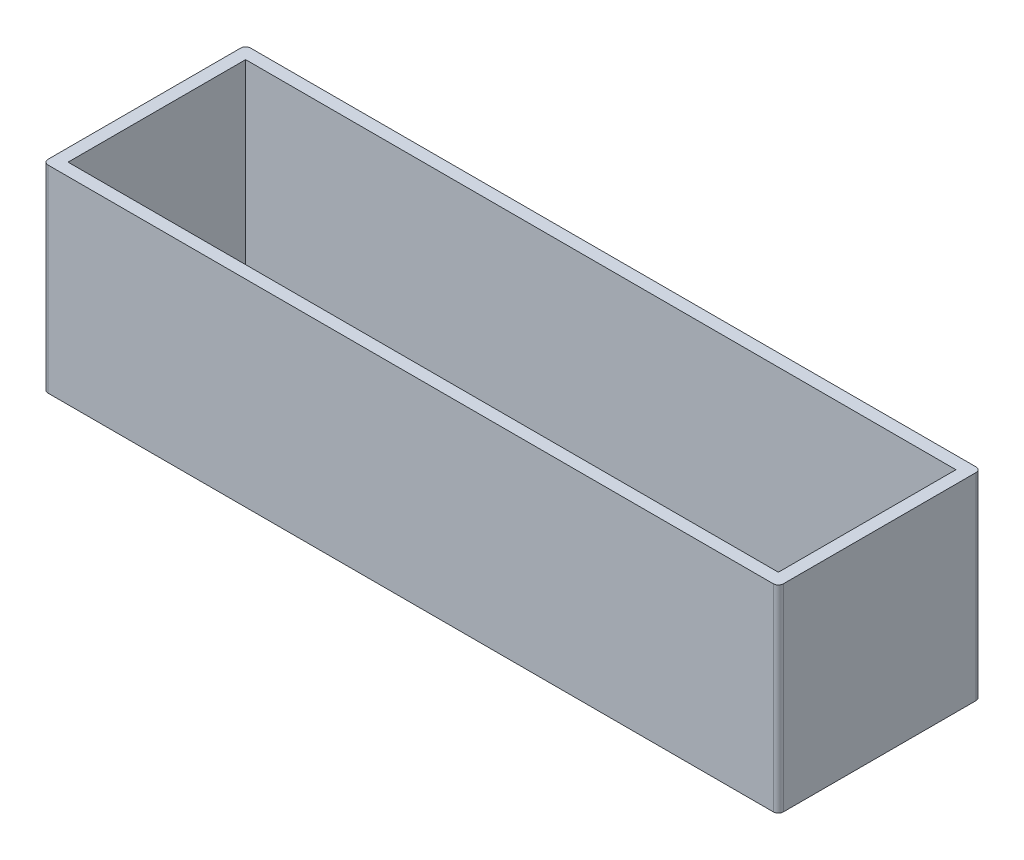
ISO-10303-21;
HEADER;
FILE_DESCRIPTION(('STEP AP214'),'2;1');
FILE_NAME('part.step','',(''),(''),'','','');
FILE_SCHEMA(('AUTOMOTIVE_DESIGN { 1 0 10303 214 1 1 1 1 }'));
ENDSEC;
DATA;
#1=APPLICATION_CONTEXT('core data for automotive mechanical design processes');
#2=APPLICATION_PROTOCOL_DEFINITION('international standard','automotive_design',2000,#1);
#3=PRODUCT_CONTEXT('',#1,'mechanical');
#4=PRODUCT('Part','Part','',(#3));
#5=PRODUCT_RELATED_PRODUCT_CATEGORY('part','',(#4));
#6=PRODUCT_DEFINITION_FORMATION('','',#4);
#7=PRODUCT_DEFINITION_CONTEXT('part definition',#1,'design');
#8=PRODUCT_DEFINITION('design','',#6,#7);
#9=PRODUCT_DEFINITION_SHAPE('','',#8);
#10=(LENGTH_UNIT() NAMED_UNIT(*) SI_UNIT(.MILLI.,.METRE.));
#11=(NAMED_UNIT(*) PLANE_ANGLE_UNIT() SI_UNIT($,.RADIAN.));
#12=(NAMED_UNIT(*) SI_UNIT($,.STERADIAN.) SOLID_ANGLE_UNIT());
#13=UNCERTAINTY_MEASURE_WITH_UNIT(LENGTH_MEASURE(1.E-05),#10,'distance_accuracy_value','');
#14=(GEOMETRIC_REPRESENTATION_CONTEXT(3) GLOBAL_UNCERTAINTY_ASSIGNED_CONTEXT((#13)) GLOBAL_UNIT_ASSIGNED_CONTEXT((#10,
#11,#12)) REPRESENTATION_CONTEXT('',''));
#15=CARTESIAN_POINT('',(0.,0.,0.));
#16=DIRECTION('',(0.,0.,1.));
#17=DIRECTION('',(1.,0.,0.));
#18=AXIS2_PLACEMENT_3D('',#15,#16,#17);
#19=CARTESIAN_POINT('',(0.,79.,0.));
#20=DIRECTION('',(0.,1.,0.));
#21=DIRECTION('',(0.,0.,1.));
#22=AXIS2_PLACEMENT_3D('',#19,#20,#21);
#23=PLANE('',#22);
#24=DIRECTION('',(1.,0.,0.));
#25=VECTOR('',#24,1.);
#26=CARTESIAN_POINT('',(147.,79.,40.5));
#27=LINE('',#26,#25);
#28=CARTESIAN_POINT('',(-145.,79.,40.5));
#29=VERTEX_POINT('',#28);
#30=CARTESIAN_POINT('',(145.,79.,40.5));
#31=VERTEX_POINT('',#30);
#32=EDGE_CURVE('E169',#29,#31,#27,.T.);
#33=ORIENTED_EDGE('',*,*,#32,.T.);
#34=CARTESIAN_POINT('',(145.,79.,38.5));
#35=DIRECTION('',(0.,1.,0.));
#36=DIRECTION('',(0.,0.,1.));
#37=AXIS2_PLACEMENT_3D('',#34,#35,#36);
#38=CIRCLE('',#37,2.);
#39=CARTESIAN_POINT('',(147.,79.,38.5));
#40=VERTEX_POINT('',#39);
#41=EDGE_CURVE('E213',#31,#40,#38,.T.);
#42=ORIENTED_EDGE('',*,*,#41,.T.);
#43=DIRECTION('',(0.,0.,-1.));
#44=VECTOR('',#43,1.);
#45=CARTESIAN_POINT('',(147.,79.,40.5));
#46=LINE('',#45,#44);
#47=CARTESIAN_POINT('',(147.,79.,-38.5));
#48=VERTEX_POINT('',#47);
#49=EDGE_CURVE('E173',#40,#48,#46,.T.);
#50=ORIENTED_EDGE('',*,*,#49,.T.);
#51=CARTESIAN_POINT('',(145.,79.,-38.5));
#52=DIRECTION('',(0.,1.,0.));
#53=DIRECTION('',(0.,0.,1.));
#54=AXIS2_PLACEMENT_3D('',#51,#52,#53);
#55=CIRCLE('',#54,2.);
#56=CARTESIAN_POINT('',(145.,79.,-40.5));
#57=VERTEX_POINT('',#56);
#58=EDGE_CURVE('E211',#48,#57,#55,.T.);
#59=ORIENTED_EDGE('',*,*,#58,.T.);
#60=DIRECTION('',(-1.,0.,0.));
#61=VECTOR('',#60,1.);
#62=CARTESIAN_POINT('',(147.,79.,-40.5));
#63=LINE('',#62,#61);
#64=CARTESIAN_POINT('',(-145.,79.,-40.5));
#65=VERTEX_POINT('',#64);
#66=EDGE_CURVE('E176',#57,#65,#63,.T.);
#67=ORIENTED_EDGE('',*,*,#66,.T.);
#68=CARTESIAN_POINT('',(-145.,79.,-38.5));
#69=DIRECTION('',(0.,1.,0.));
#70=DIRECTION('',(0.,0.,1.));
#71=AXIS2_PLACEMENT_3D('',#68,#69,#70);
#72=CIRCLE('',#71,2.);
#73=CARTESIAN_POINT('',(-147.,79.,-38.5));
#74=VERTEX_POINT('',#73);
#75=EDGE_CURVE('E207',#65,#74,#72,.T.);
#76=ORIENTED_EDGE('',*,*,#75,.T.);
#77=DIRECTION('',(0.,0.,1.));
#78=VECTOR('',#77,1.);
#79=CARTESIAN_POINT('',(-147.,79.,40.5));
#80=LINE('',#79,#78);
#81=CARTESIAN_POINT('',(-147.,79.,38.5));
#82=VERTEX_POINT('',#81);
#83=EDGE_CURVE('E166',#74,#82,#80,.T.);
#84=ORIENTED_EDGE('',*,*,#83,.T.);
#85=CARTESIAN_POINT('',(-145.,79.,38.5));
#86=DIRECTION('',(0.,1.,0.));
#87=DIRECTION('',(0.,0.,1.));
#88=AXIS2_PLACEMENT_3D('',#85,#86,#87);
#89=CIRCLE('',#88,2.);
#90=EDGE_CURVE('E209',#82,#29,#89,.T.);
#91=ORIENTED_EDGE('',*,*,#90,.T.);
#92=EDGE_LOOP('',(#33,#42,#50,#59,#67,#76,#84,#91));
#93=FACE_BOUND('',#92,.T.);
#94=DIRECTION('',(1.,0.,0.));
#95=VECTOR('',#94,1.);
#96=CARTESIAN_POINT('',(142.,79.,35.5));
#97=LINE('',#96,#95);
#98=CARTESIAN_POINT('',(-142.,79.,35.5));
#99=VERTEX_POINT('',#98);
#100=CARTESIAN_POINT('',(142.,79.,35.5));
#101=VERTEX_POINT('',#100);
#102=EDGE_CURVE('E146',#99,#101,#97,.T.);
#103=ORIENTED_EDGE('',*,*,#102,.F.);
#104=DIRECTION('',(0.,0.,1.));
#105=VECTOR('',#104,1.);
#106=CARTESIAN_POINT('',(-142.,79.,35.5));
#107=LINE('',#106,#105);
#108=CARTESIAN_POINT('',(-142.,79.,-35.5));
#109=VERTEX_POINT('',#108);
#110=EDGE_CURVE('E136',#109,#99,#107,.T.);
#111=ORIENTED_EDGE('',*,*,#110,.F.);
#112=DIRECTION('',(-1.,0.,0.));
#113=VECTOR('',#112,1.);
#114=CARTESIAN_POINT('',(142.,79.,-35.5));
#115=LINE('',#114,#113);
#116=CARTESIAN_POINT('',(142.,79.,-35.5));
#117=VERTEX_POINT('',#116);
#118=EDGE_CURVE('E158',#117,#109,#115,.T.);
#119=ORIENTED_EDGE('',*,*,#118,.F.);
#120=DIRECTION('',(0.,0.,-1.));
#121=VECTOR('',#120,1.);
#122=CARTESIAN_POINT('',(142.,79.,35.5));
#123=LINE('',#122,#121);
#124=EDGE_CURVE('E156',#101,#117,#123,.T.);
#125=ORIENTED_EDGE('',*,*,#124,.F.);
#126=EDGE_LOOP('',(#103,#111,#119,#125));
#127=FACE_BOUND('',#126,.T.);
#128=ADVANCED_FACE('F32',(#93,#127),#23,.T.);
#129=CARTESIAN_POINT('',(0.,0.,0.));
#130=DIRECTION('',(0.,1.,0.));
#131=DIRECTION('',(0.,0.,1.));
#132=AXIS2_PLACEMENT_3D('',#129,#130,#131);
#133=PLANE('',#132);
#134=DIRECTION('',(-1.,0.,0.));
#135=VECTOR('',#134,1.);
#136=CARTESIAN_POINT('',(-142.,0.,-38.9641016151377));
#137=LINE('',#136,#135);
#138=CARTESIAN_POINT('',(145.464101615138,0.,-38.9641016151378));
#139=VERTEX_POINT('',#138);
#140=CARTESIAN_POINT('',(-145.464101615138,0.,-38.9641016151377));
#141=VERTEX_POINT('',#140);
#142=EDGE_CURVE('E229',#139,#141,#137,.T.);
#143=ORIENTED_EDGE('',*,*,#142,.T.);
#144=DIRECTION('',(0.,0.,1.));
#145=VECTOR('',#144,1.);
#146=CARTESIAN_POINT('',(-145.464101615138,0.,35.5));
#147=LINE('',#146,#145);
#148=CARTESIAN_POINT('',(-145.464101615138,0.,38.9641016151378));
#149=VERTEX_POINT('',#148);
#150=EDGE_CURVE('E231',#141,#149,#147,.T.);
#151=ORIENTED_EDGE('',*,*,#150,.T.);
#152=DIRECTION('',(1.,0.,0.));
#153=VECTOR('',#152,1.);
#154=CARTESIAN_POINT('',(142.,0.,38.9641016151378));
#155=LINE('',#154,#153);
#156=CARTESIAN_POINT('',(145.464101615138,0.,38.9641016151378));
#157=VERTEX_POINT('',#156);
#158=EDGE_CURVE('E225',#149,#157,#155,.T.);
#159=ORIENTED_EDGE('',*,*,#158,.T.);
#160=DIRECTION('',(0.,0.,-1.));
#161=VECTOR('',#160,1.);
#162=CARTESIAN_POINT('',(145.464101615138,0.,-35.5));
#163=LINE('',#162,#161);
#164=EDGE_CURVE('E227',#157,#139,#163,.T.);
#165=ORIENTED_EDGE('',*,*,#164,.T.);
#166=EDGE_LOOP('',(#143,#151,#159,#165));
#167=FACE_BOUND('',#166,.T.);
#168=DIRECTION('',(0.,0.,-1.));
#169=VECTOR('',#168,1.);
#170=CARTESIAN_POINT('',(147.,0.,40.5));
#171=LINE('',#170,#169);
#172=CARTESIAN_POINT('',(147.,0.,38.5));
#173=VERTEX_POINT('',#172);
#174=CARTESIAN_POINT('',(147.,0.,-38.5));
#175=VERTEX_POINT('',#174);
#176=EDGE_CURVE('E185',#173,#175,#171,.T.);
#177=ORIENTED_EDGE('',*,*,#176,.F.);
#178=CARTESIAN_POINT('',(145.,0.,38.5));
#179=DIRECTION('',(0.,1.,0.));
#180=DIRECTION('',(0.,0.,1.));
#181=AXIS2_PLACEMENT_3D('',#178,#179,#180);
#182=CIRCLE('',#181,2.);
#183=CARTESIAN_POINT('',(145.,0.,40.5));
#184=VERTEX_POINT('',#183);
#185=EDGE_CURVE('E200',#173,#184,#182,.F.);
#186=ORIENTED_EDGE('',*,*,#185,.T.);
#187=DIRECTION('',(1.,0.,0.));
#188=VECTOR('',#187,1.);
#189=CARTESIAN_POINT('',(147.,0.,40.5));
#190=LINE('',#189,#188);
#191=CARTESIAN_POINT('',(-145.,0.,40.5));
#192=VERTEX_POINT('',#191);
#193=EDGE_CURVE('E182',#192,#184,#190,.T.);
#194=ORIENTED_EDGE('',*,*,#193,.F.);
#195=CARTESIAN_POINT('',(-145.,0.,38.5));
#196=DIRECTION('',(0.,1.,0.));
#197=DIRECTION('',(0.,0.,1.));
#198=AXIS2_PLACEMENT_3D('',#195,#196,#197);
#199=CIRCLE('',#198,2.);
#200=CARTESIAN_POINT('',(-147.,0.,38.5));
#201=VERTEX_POINT('',#200);
#202=EDGE_CURVE('E196',#192,#201,#199,.F.);
#203=ORIENTED_EDGE('',*,*,#202,.T.);
#204=DIRECTION('',(0.,0.,1.));
#205=VECTOR('',#204,1.);
#206=CARTESIAN_POINT('',(-147.,0.,40.5));
#207=LINE('',#206,#205);
#208=CARTESIAN_POINT('',(-147.,0.,-38.5));
#209=VERTEX_POINT('',#208);
#210=EDGE_CURVE('E151',#209,#201,#207,.T.);
#211=ORIENTED_EDGE('',*,*,#210,.F.);
#212=CARTESIAN_POINT('',(-145.,0.,-38.5));
#213=DIRECTION('',(0.,1.,0.));
#214=DIRECTION('',(0.,0.,1.));
#215=AXIS2_PLACEMENT_3D('',#212,#213,#214);
#216=CIRCLE('',#215,2.);
#217=CARTESIAN_POINT('',(-145.,0.,-40.5));
#218=VERTEX_POINT('',#217);
#219=EDGE_CURVE('E194',#209,#218,#216,.F.);
#220=ORIENTED_EDGE('',*,*,#219,.T.);
#221=DIRECTION('',(-1.,0.,0.));
#222=VECTOR('',#221,1.);
#223=CARTESIAN_POINT('',(147.,0.,-40.5));
#224=LINE('',#223,#222);
#225=CARTESIAN_POINT('',(145.,0.,-40.5));
#226=VERTEX_POINT('',#225);
#227=EDGE_CURVE('E170',#226,#218,#224,.T.);
#228=ORIENTED_EDGE('',*,*,#227,.F.);
#229=CARTESIAN_POINT('',(145.,0.,-38.5));
#230=DIRECTION('',(0.,1.,0.));
#231=DIRECTION('',(0.,0.,1.));
#232=AXIS2_PLACEMENT_3D('',#229,#230,#231);
#233=CIRCLE('',#232,2.);
#234=EDGE_CURVE('E198',#226,#175,#233,.F.);
#235=ORIENTED_EDGE('',*,*,#234,.T.);
#236=EDGE_LOOP('',(#177,#186,#194,#203,#211,#220,#228,#235));
#237=FACE_BOUND('',#236,.T.);
#238=ADVANCED_FACE('F271',(#167,#237),#133,.F.);
#239=CARTESIAN_POINT('',(-147.,79.,40.5));
#240=DIRECTION('',(1.,0.,0.));
#241=DIRECTION('',(0.,0.,-1.));
#242=AXIS2_PLACEMENT_3D('',#239,#240,#241);
#243=PLANE('',#242);
#244=ORIENTED_EDGE('',*,*,#210,.T.);
#245=DIRECTION('',(0.,-1.,0.));
#246=VECTOR('',#245,1.);
#247=CARTESIAN_POINT('',(-147.,79.,38.5));
#248=LINE('',#247,#246);
#249=EDGE_CURVE('E223',#201,#82,#248,.F.);
#250=ORIENTED_EDGE('',*,*,#249,.T.);
#251=ORIENTED_EDGE('',*,*,#83,.F.);
#252=DIRECTION('',(0.,-1.,0.));
#253=VECTOR('',#252,1.);
#254=CARTESIAN_POINT('',(-147.,79.,-38.5));
#255=LINE('',#254,#253);
#256=EDGE_CURVE('E220',#74,#209,#255,.T.);
#257=ORIENTED_EDGE('',*,*,#256,.T.);
#258=EDGE_LOOP('',(#244,#250,#251,#257));
#259=FACE_BOUND('',#258,.T.);
#260=ADVANCED_FACE('F278',(#259),#243,.F.);
#261=CARTESIAN_POINT('',(147.,79.,40.5));
#262=DIRECTION('',(0.,0.,-1.));
#263=DIRECTION('',(-1.,0.,0.));
#264=AXIS2_PLACEMENT_3D('',#261,#262,#263);
#265=PLANE('',#264);
#266=ORIENTED_EDGE('',*,*,#193,.T.);
#267=DIRECTION('',(0.,-1.,0.));
#268=VECTOR('',#267,1.);
#269=CARTESIAN_POINT('',(145.,79.,40.5));
#270=LINE('',#269,#268);
#271=EDGE_CURVE('E205',#184,#31,#270,.F.);
#272=ORIENTED_EDGE('',*,*,#271,.T.);
#273=ORIENTED_EDGE('',*,*,#32,.F.);
#274=DIRECTION('',(0.,-1.,0.));
#275=VECTOR('',#274,1.);
#276=CARTESIAN_POINT('',(-145.,79.,40.5));
#277=LINE('',#276,#275);
#278=EDGE_CURVE('E202',#29,#192,#277,.T.);
#279=ORIENTED_EDGE('',*,*,#278,.T.);
#280=EDGE_LOOP('',(#266,#272,#273,#279));
#281=FACE_BOUND('',#280,.T.);
#282=ADVANCED_FACE('F290',(#281),#265,.F.);
#283=CARTESIAN_POINT('',(147.,79.,40.5));
#284=DIRECTION('',(-1.,0.,0.));
#285=DIRECTION('',(0.,0.,1.));
#286=AXIS2_PLACEMENT_3D('',#283,#284,#285);
#287=PLANE('',#286);
#288=ORIENTED_EDGE('',*,*,#49,.F.);
#289=DIRECTION('',(0.,-1.,0.));
#290=VECTOR('',#289,1.);
#291=CARTESIAN_POINT('',(147.,79.,38.5));
#292=LINE('',#291,#290);
#293=EDGE_CURVE('E191',#40,#173,#292,.T.);
#294=ORIENTED_EDGE('',*,*,#293,.T.);
#295=ORIENTED_EDGE('',*,*,#176,.T.);
#296=DIRECTION('',(0.,-1.,0.));
#297=VECTOR('',#296,1.);
#298=CARTESIAN_POINT('',(147.,79.,-38.5));
#299=LINE('',#298,#297);
#300=EDGE_CURVE('E179',#175,#48,#299,.F.);
#301=ORIENTED_EDGE('',*,*,#300,.T.);
#302=EDGE_LOOP('',(#288,#294,#295,#301));
#303=FACE_BOUND('',#302,.T.);
#304=ADVANCED_FACE('F286',(#303),#287,.F.);
#305=CARTESIAN_POINT('',(147.,79.,-40.5));
#306=DIRECTION('',(0.,0.,1.));
#307=DIRECTION('',(1.,0.,0.));
#308=AXIS2_PLACEMENT_3D('',#305,#306,#307);
#309=PLANE('',#308);
#310=ORIENTED_EDGE('',*,*,#66,.F.);
#311=DIRECTION('',(0.,-1.,0.));
#312=VECTOR('',#311,1.);
#313=CARTESIAN_POINT('',(145.,79.,-40.5));
#314=LINE('',#313,#312);
#315=EDGE_CURVE('E217',#57,#226,#314,.T.);
#316=ORIENTED_EDGE('',*,*,#315,.T.);
#317=ORIENTED_EDGE('',*,*,#227,.T.);
#318=DIRECTION('',(0.,-1.,0.));
#319=VECTOR('',#318,1.);
#320=CARTESIAN_POINT('',(-145.,79.,-40.5));
#321=LINE('',#320,#319);
#322=EDGE_CURVE('E215',#218,#65,#321,.F.);
#323=ORIENTED_EDGE('',*,*,#322,.T.);
#324=EDGE_LOOP('',(#310,#316,#317,#323));
#325=FACE_BOUND('',#324,.T.);
#326=ADVANCED_FACE('F283',(#325),#309,.F.);
#327=CARTESIAN_POINT('',(-142.,79.,35.5));
#328=DIRECTION('',(1.,0.,0.));
#329=DIRECTION('',(0.,0.,-1.));
#330=AXIS2_PLACEMENT_3D('',#327,#328,#329);
#331=PLANE('',#330);
#332=DIRECTION('',(0.,-1.,0.));
#333=VECTOR('',#332,1.);
#334=CARTESIAN_POINT('',(-142.,79.,35.5));
#335=LINE('',#334,#333);
#336=CARTESIAN_POINT('',(-142.,2.00000000000003,35.5));
#337=VERTEX_POINT('',#336);
#338=EDGE_CURVE('E140',#99,#337,#335,.T.);
#339=ORIENTED_EDGE('',*,*,#338,.T.);
#340=DIRECTION('',(0.,0.,-1.));
#341=VECTOR('',#340,1.);
#342=CARTESIAN_POINT('',(-142.,2.00000000000003,-35.5));
#343=LINE('',#342,#341);
#344=CARTESIAN_POINT('',(-142.,2.00000000000003,-35.5));
#345=VERTEX_POINT('',#344);
#346=EDGE_CURVE('E234',#337,#345,#343,.T.);
#347=ORIENTED_EDGE('',*,*,#346,.T.);
#348=DIRECTION('',(0.,-1.,0.));
#349=VECTOR('',#348,1.);
#350=CARTESIAN_POINT('',(-142.,79.,-35.5));
#351=LINE('',#350,#349);
#352=EDGE_CURVE('E142',#109,#345,#351,.T.);
#353=ORIENTED_EDGE('',*,*,#352,.F.);
#354=ORIENTED_EDGE('',*,*,#110,.T.);
#355=EDGE_LOOP('',(#339,#347,#353,#354));
#356=FACE_BOUND('',#355,.T.);
#357=ADVANCED_FACE('F138',(#356),#331,.T.);
#358=CARTESIAN_POINT('',(142.,79.,35.5));
#359=DIRECTION('',(0.,0.,-1.));
#360=DIRECTION('',(-1.,0.,0.));
#361=AXIS2_PLACEMENT_3D('',#358,#359,#360);
#362=PLANE('',#361);
#363=DIRECTION('',(0.,-1.,0.));
#364=VECTOR('',#363,1.);
#365=CARTESIAN_POINT('',(142.,79.,35.5));
#366=LINE('',#365,#364);
#367=CARTESIAN_POINT('',(142.,2.00000000000003,35.5));
#368=VERTEX_POINT('',#367);
#369=EDGE_CURVE('E152',#101,#368,#366,.T.);
#370=ORIENTED_EDGE('',*,*,#369,.T.);
#371=DIRECTION('',(-1.,0.,0.));
#372=VECTOR('',#371,1.);
#373=CARTESIAN_POINT('',(-142.,2.00000000000003,35.5));
#374=LINE('',#373,#372);
#375=EDGE_CURVE('E11',#368,#337,#374,.T.);
#376=ORIENTED_EDGE('',*,*,#375,.T.);
#377=ORIENTED_EDGE('',*,*,#338,.F.);
#378=ORIENTED_EDGE('',*,*,#102,.T.);
#379=EDGE_LOOP('',(#370,#376,#377,#378));
#380=FACE_BOUND('',#379,.T.);
#381=ADVANCED_FACE('F149',(#380),#362,.T.);
#382=CARTESIAN_POINT('',(142.,79.,35.5));
#383=DIRECTION('',(-1.,0.,0.));
#384=DIRECTION('',(0.,0.,1.));
#385=AXIS2_PLACEMENT_3D('',#382,#383,#384);
#386=PLANE('',#385);
#387=DIRECTION('',(0.,-1.,0.));
#388=VECTOR('',#387,1.);
#389=CARTESIAN_POINT('',(142.,79.,-35.5));
#390=LINE('',#389,#388);
#391=CARTESIAN_POINT('',(142.,2.00000000000003,-35.5));
#392=VERTEX_POINT('',#391);
#393=EDGE_CURVE('E163',#117,#392,#390,.T.);
#394=ORIENTED_EDGE('',*,*,#393,.T.);
#395=DIRECTION('',(0.,0.,1.));
#396=VECTOR('',#395,1.);
#397=CARTESIAN_POINT('',(142.,2.00000000000003,35.5));
#398=LINE('',#397,#396);
#399=EDGE_CURVE('E41',#392,#368,#398,.T.);
#400=ORIENTED_EDGE('',*,*,#399,.T.);
#401=ORIENTED_EDGE('',*,*,#369,.F.);
#402=ORIENTED_EDGE('',*,*,#124,.T.);
#403=EDGE_LOOP('',(#394,#400,#401,#402));
#404=FACE_BOUND('',#403,.T.);
#405=ADVANCED_FACE('F260',(#404),#386,.T.);
#406=CARTESIAN_POINT('',(142.,79.,-35.5));
#407=DIRECTION('',(0.,0.,1.));
#408=DIRECTION('',(1.,0.,0.));
#409=AXIS2_PLACEMENT_3D('',#406,#407,#408);
#410=PLANE('',#409);
#411=ORIENTED_EDGE('',*,*,#352,.T.);
#412=DIRECTION('',(1.,0.,0.));
#413=VECTOR('',#412,1.);
#414=CARTESIAN_POINT('',(142.,2.00000000000003,-35.5));
#415=LINE('',#414,#413);
#416=EDGE_CURVE('E56',#345,#392,#415,.T.);
#417=ORIENTED_EDGE('',*,*,#416,.T.);
#418=ORIENTED_EDGE('',*,*,#393,.F.);
#419=ORIENTED_EDGE('',*,*,#118,.T.);
#420=EDGE_LOOP('',(#411,#417,#418,#419));
#421=FACE_BOUND('',#420,.T.);
#422=ADVANCED_FACE('F259',(#421),#410,.T.);
#423=CARTESIAN_POINT('',(145.,79.,38.5));
#424=DIRECTION('',(0.,-1.,0.));
#425=DIRECTION('',(0.,0.,-1.));
#426=AXIS2_PLACEMENT_3D('',#423,#424,#425);
#427=CYLINDRICAL_SURFACE('',#426,2.);
#428=ORIENTED_EDGE('',*,*,#41,.F.);
#429=ORIENTED_EDGE('',*,*,#271,.F.);
#430=ORIENTED_EDGE('',*,*,#185,.F.);
#431=ORIENTED_EDGE('',*,*,#293,.F.);
#432=EDGE_LOOP('',(#428,#429,#430,#431));
#433=FACE_BOUND('',#432,.T.);
#434=ADVANCED_FACE('F267',(#433),#427,.T.);
#435=CARTESIAN_POINT('',(145.,79.,-38.5));
#436=DIRECTION('',(0.,-1.,0.));
#437=DIRECTION('',(0.,0.,-1.));
#438=AXIS2_PLACEMENT_3D('',#435,#436,#437);
#439=CYLINDRICAL_SURFACE('',#438,2.);
#440=ORIENTED_EDGE('',*,*,#58,.F.);
#441=ORIENTED_EDGE('',*,*,#300,.F.);
#442=ORIENTED_EDGE('',*,*,#234,.F.);
#443=ORIENTED_EDGE('',*,*,#315,.F.);
#444=EDGE_LOOP('',(#440,#441,#442,#443));
#445=FACE_BOUND('',#444,.T.);
#446=ADVANCED_FACE('F300',(#445),#439,.T.);
#447=CARTESIAN_POINT('',(-145.,79.,38.5));
#448=DIRECTION('',(0.,-1.,0.));
#449=DIRECTION('',(0.,0.,-1.));
#450=AXIS2_PLACEMENT_3D('',#447,#448,#449);
#451=CYLINDRICAL_SURFACE('',#450,2.);
#452=ORIENTED_EDGE('',*,*,#90,.F.);
#453=ORIENTED_EDGE('',*,*,#249,.F.);
#454=ORIENTED_EDGE('',*,*,#202,.F.);
#455=ORIENTED_EDGE('',*,*,#278,.F.);
#456=EDGE_LOOP('',(#452,#453,#454,#455));
#457=FACE_BOUND('',#456,.T.);
#458=ADVANCED_FACE('F304',(#457),#451,.T.);
#459=CARTESIAN_POINT('',(-145.,79.,-38.5));
#460=DIRECTION('',(0.,-1.,0.));
#461=DIRECTION('',(0.,0.,-1.));
#462=AXIS2_PLACEMENT_3D('',#459,#460,#461);
#463=CYLINDRICAL_SURFACE('',#462,2.);
#464=ORIENTED_EDGE('',*,*,#75,.F.);
#465=ORIENTED_EDGE('',*,*,#322,.F.);
#466=ORIENTED_EDGE('',*,*,#219,.F.);
#467=ORIENTED_EDGE('',*,*,#256,.F.);
#468=EDGE_LOOP('',(#464,#465,#466,#467));
#469=FACE_BOUND('',#468,.T.);
#470=ADVANCED_FACE('F308',(#469),#463,.T.);
#471=CARTESIAN_POINT('',(145.464101615138,0.,0.));
#472=DIRECTION('',(-0.500000000000004,-0.866025403784437,0.));
#473=DIRECTION('',(0.,0.,1.));
#474=AXIS2_PLACEMENT_3D('',#471,#472,#473);
#475=PLANE('',#474);
#476=DIRECTION('',(0.654653670707976,-0.37796447300923,0.654653670707977));
#477=VECTOR('',#476,1.);
#478=CARTESIAN_POINT('',(128.765200922936,9.64111480981367,22.2652009229359));
#479=LINE('',#478,#477);
#480=EDGE_CURVE('E241',#368,#157,#479,.T.);
#481=ORIENTED_EDGE('',*,*,#480,.F.);
#482=ORIENTED_EDGE('',*,*,#399,.F.);
#483=DIRECTION('',(0.654653670707976,-0.37796447300923,-0.654653670707976));
#484=VECTOR('',#483,1.);
#485=CARTESIAN_POINT('',(83.1223437800789,35.9930306678261,23.3776562199211));
#486=LINE('',#485,#484);
#487=EDGE_CURVE('E36',#139,#392,#486,.F.);
#488=ORIENTED_EDGE('',*,*,#487,.F.);
#489=ORIENTED_EDGE('',*,*,#164,.F.);
#490=EDGE_LOOP('',(#481,#482,#488,#489));
#491=FACE_BOUND('',#490,.T.);
#492=ADVANCED_FACE('F34',(#491),#475,.T.);
#493=CARTESIAN_POINT('',(0.,0.,-38.9641016151378));
#494=DIRECTION('',(0.,-0.866025403784437,0.500000000000004));
#495=DIRECTION('',(1.,0.,0.));
#496=AXIS2_PLACEMENT_3D('',#493,#494,#495);
#497=PLANE('',#496);
#498=ORIENTED_EDGE('',*,*,#487,.T.);
#499=ORIENTED_EDGE('',*,*,#416,.F.);
#500=DIRECTION('',(-0.654653670707976,-0.37796447300923,-0.654653670707976));
#501=VECTOR('',#500,1.);
#502=CARTESIAN_POINT('',(-128.765200922936,9.64111480981366,-22.2652009229359));
#503=LINE('',#502,#501);
#504=EDGE_CURVE('E240',#141,#345,#503,.F.);
#505=ORIENTED_EDGE('',*,*,#504,.F.);
#506=ORIENTED_EDGE('',*,*,#142,.F.);
#507=EDGE_LOOP('',(#498,#499,#505,#506));
#508=FACE_BOUND('',#507,.T.);
#509=ADVANCED_FACE('F250',(#508),#497,.T.);
#510=CARTESIAN_POINT('',(0.,0.,38.9641016151378));
#511=DIRECTION('',(0.,-0.866025403784437,-0.500000000000003));
#512=DIRECTION('',(-1.,0.,0.));
#513=AXIS2_PLACEMENT_3D('',#510,#511,#512);
#514=PLANE('',#513);
#515=ORIENTED_EDGE('',*,*,#480,.T.);
#516=ORIENTED_EDGE('',*,*,#158,.F.);
#517=DIRECTION('',(0.654653670707976,0.37796447300923,-0.654653670707977));
#518=VECTOR('',#517,1.);
#519=CARTESIAN_POINT('',(-128.765200922936,9.64111480981368,22.2652009229359));
#520=LINE('',#519,#518);
#521=EDGE_CURVE('E238',#337,#149,#520,.F.);
#522=ORIENTED_EDGE('',*,*,#521,.F.);
#523=ORIENTED_EDGE('',*,*,#375,.F.);
#524=EDGE_LOOP('',(#515,#516,#522,#523));
#525=FACE_BOUND('',#524,.T.);
#526=ADVANCED_FACE('F255',(#525),#514,.T.);
#527=CARTESIAN_POINT('',(-145.464101615138,0.,0.));
#528=DIRECTION('',(0.500000000000004,-0.866025403784437,0.));
#529=DIRECTION('',(0.,0.,-1.));
#530=AXIS2_PLACEMENT_3D('',#527,#528,#529);
#531=PLANE('',#530);
#532=ORIENTED_EDGE('',*,*,#504,.T.);
#533=ORIENTED_EDGE('',*,*,#346,.F.);
#534=ORIENTED_EDGE('',*,*,#521,.T.);
#535=ORIENTED_EDGE('',*,*,#150,.F.);
#536=EDGE_LOOP('',(#532,#533,#534,#535));
#537=FACE_BOUND('',#536,.T.);
#538=ADVANCED_FACE('F258',(#537),#531,.T.);
#539=CLOSED_SHELL('',(#128,#238,#260,#282,#304,#326,#357,#381,#405,#422,#434,#446,#458,#470,
#492,#509,#526,#538));
#540=MANIFOLD_SOLID_BREP('B2',#539);
#541=ADVANCED_BREP_SHAPE_REPRESENTATION('',(#18,#540),#14);
#542=SHAPE_DEFINITION_REPRESENTATION(#9,#541);
ENDSEC;
END-ISO-10303-21;
